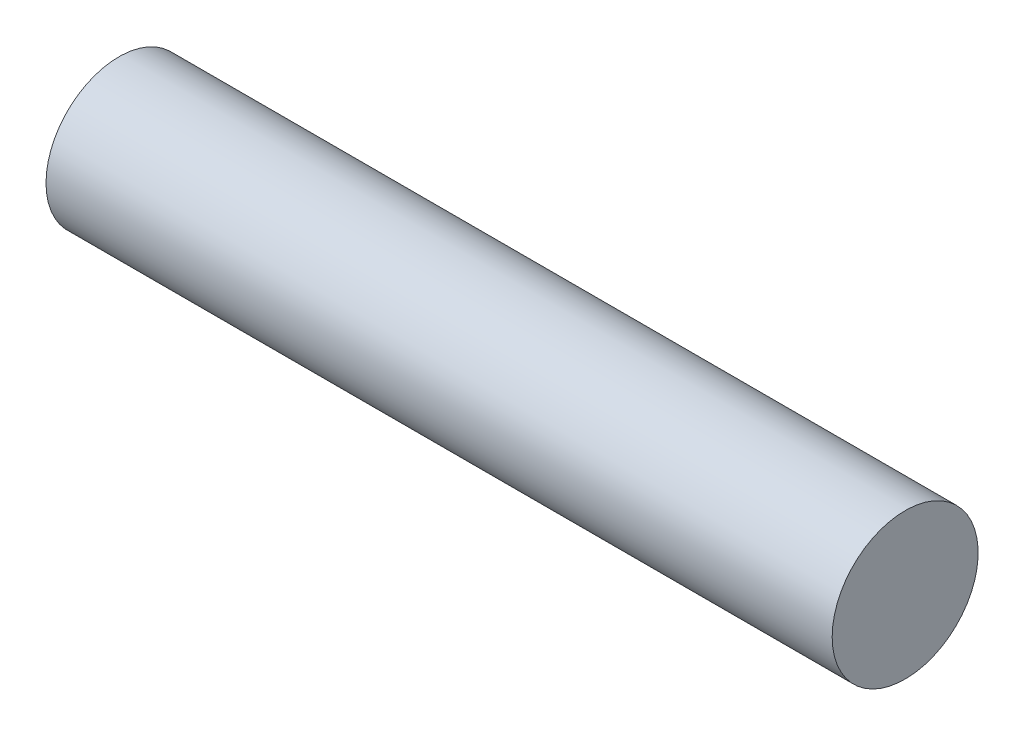
ISO-10303-21;
HEADER;
FILE_DESCRIPTION(('STEP AP214'),'2;1');
FILE_NAME('part.step','',(''),(''),'','','');
FILE_SCHEMA(('AUTOMOTIVE_DESIGN { 1 0 10303 214 1 1 1 1 }'));
ENDSEC;
DATA;
#1=APPLICATION_CONTEXT('core data for automotive mechanical design processes');
#2=APPLICATION_PROTOCOL_DEFINITION('international standard','automotive_design',2000,#1);
#3=PRODUCT_CONTEXT('',#1,'mechanical');
#4=PRODUCT('Part','Part','',(#3));
#5=PRODUCT_RELATED_PRODUCT_CATEGORY('part','',(#4));
#6=PRODUCT_DEFINITION_FORMATION('','',#4);
#7=PRODUCT_DEFINITION_CONTEXT('part definition',#1,'design');
#8=PRODUCT_DEFINITION('design','',#6,#7);
#9=PRODUCT_DEFINITION_SHAPE('','',#8);
#10=(LENGTH_UNIT() NAMED_UNIT(*) SI_UNIT(.MILLI.,.METRE.));
#11=(NAMED_UNIT(*) PLANE_ANGLE_UNIT() SI_UNIT($,.RADIAN.));
#12=(NAMED_UNIT(*) SI_UNIT($,.STERADIAN.) SOLID_ANGLE_UNIT());
#13=UNCERTAINTY_MEASURE_WITH_UNIT(LENGTH_MEASURE(1.E-05),#10,'distance_accuracy_value','');
#14=(GEOMETRIC_REPRESENTATION_CONTEXT(3) GLOBAL_UNCERTAINTY_ASSIGNED_CONTEXT((#13)) GLOBAL_UNIT_ASSIGNED_CONTEXT((#10,
#11,#12)) REPRESENTATION_CONTEXT('',''));
#15=CARTESIAN_POINT('',(0.,0.,0.));
#16=DIRECTION('',(0.,0.,1.));
#17=DIRECTION('',(1.,0.,0.));
#18=AXIS2_PLACEMENT_3D('',#15,#16,#17);
#19=CARTESIAN_POINT('',(-34.1918459360891,-5.23965718710616,0.));
#20=DIRECTION('',(-1.,0.,0.));
#21=DIRECTION('',(0.,0.,1.));
#22=AXIS2_PLACEMENT_3D('',#19,#20,#21);
#23=PLANE('',#22);
#24=CARTESIAN_POINT('',(-34.1918459360891,-5.23965718710616,0.));
#25=DIRECTION('',(-1.,0.,0.));
#26=DIRECTION('',(0.,0.,1.));
#27=AXIS2_PLACEMENT_3D('',#24,#25,#26);
#28=CIRCLE('',#27,44.271024872523);
#29=CARTESIAN_POINT('',(-34.1918459360891,-5.23965718710616,44.271024872523));
#30=VERTEX_POINT('',#29);
#31=EDGE_CURVE('E10',#30,#30,#28,.T.);
#32=ORIENTED_EDGE('',*,*,#31,.F.);
#33=EDGE_LOOP('',(#32));
#34=FACE_BOUND('',#33,.T.);
#35=ADVANCED_FACE('F33',(#34),#23,.F.);
#36=CARTESIAN_POINT('',(-511.045589327537,-5.23965718710616,0.));
#37=DIRECTION('',(-1.,0.,0.));
#38=DIRECTION('',(0.,0.,1.));
#39=AXIS2_PLACEMENT_3D('',#36,#37,#38);
#40=CYLINDRICAL_SURFACE('',#39,44.271024872523);
#41=CARTESIAN_POINT('',(-511.045589327537,-5.23965718710616,0.));
#42=DIRECTION('',(-1.,0.,0.));
#43=DIRECTION('',(0.,0.,1.));
#44=AXIS2_PLACEMENT_3D('',#41,#42,#43);
#45=CIRCLE('',#44,44.271024872523);
#46=CARTESIAN_POINT('',(-511.045589327537,-5.23965718710616,44.271024872523));
#47=VERTEX_POINT('',#46);
#48=EDGE_CURVE('E39',#47,#47,#45,.T.);
#49=ORIENTED_EDGE('',*,*,#48,.F.);
#50=EDGE_LOOP('',(#49));
#51=FACE_BOUND('',#50,.T.);
#52=ORIENTED_EDGE('',*,*,#31,.T.);
#53=EDGE_LOOP('',(#52));
#54=FACE_BOUND('',#53,.T.);
#55=ADVANCED_FACE('F47',(#51,#54),#40,.T.);
#56=CARTESIAN_POINT('',(-511.045589327537,39.0313676854169,0.));
#57=DIRECTION('',(1.,0.,0.));
#58=DIRECTION('',(0.,0.,-1.));
#59=AXIS2_PLACEMENT_3D('',#56,#57,#58);
#60=PLANE('',#59);
#61=ORIENTED_EDGE('',*,*,#48,.T.);
#62=EDGE_LOOP('',(#61));
#63=FACE_BOUND('',#62,.T.);
#64=ADVANCED_FACE('F45',(#63),#60,.F.);
#65=CLOSED_SHELL('',(#35,#55,#64));
#66=MANIFOLD_SOLID_BREP('B2',#65);
#67=ADVANCED_BREP_SHAPE_REPRESENTATION('',(#18,#66),#14);
#68=SHAPE_DEFINITION_REPRESENTATION(#9,#67);
ENDSEC;
END-ISO-10303-21;
